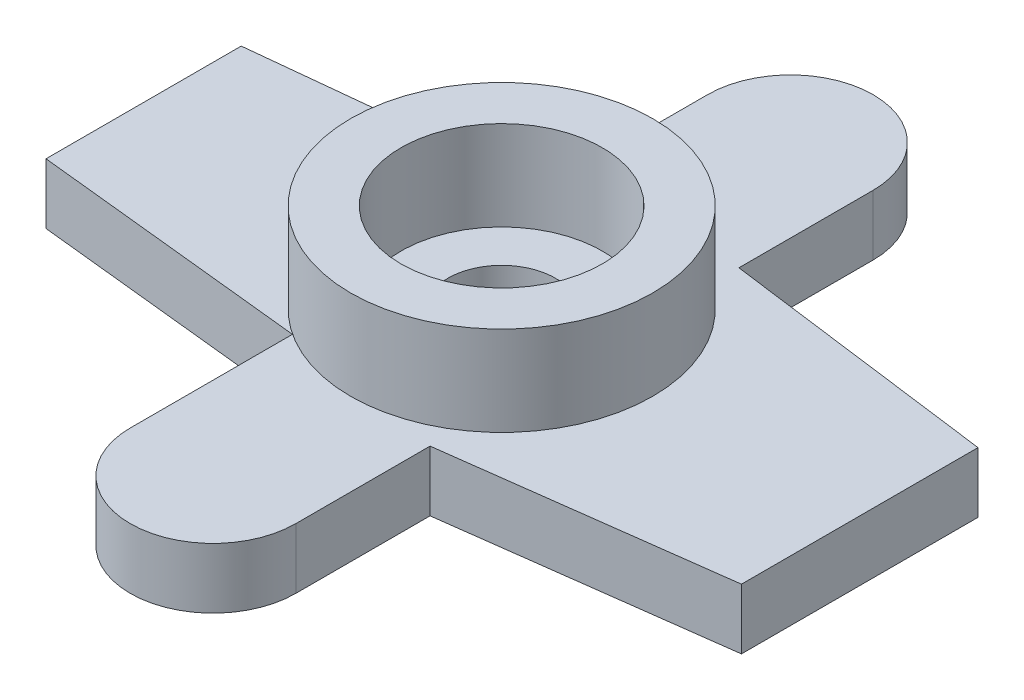
ISO-10303-21;
HEADER;
FILE_DESCRIPTION(('STEP AP214'),'2;1');
FILE_NAME('part.step','',(''),(''),'','','');
FILE_SCHEMA(('AUTOMOTIVE_DESIGN { 1 0 10303 214 1 1 1 1 }'));
ENDSEC;
DATA;
#1=APPLICATION_CONTEXT('core data for automotive mechanical design processes');
#2=APPLICATION_PROTOCOL_DEFINITION('international standard','automotive_design',2000,#1);
#3=PRODUCT_CONTEXT('',#1,'mechanical');
#4=PRODUCT('Part','Part','',(#3));
#5=PRODUCT_RELATED_PRODUCT_CATEGORY('part','',(#4));
#6=PRODUCT_DEFINITION_FORMATION('','',#4);
#7=PRODUCT_DEFINITION_CONTEXT('part definition',#1,'design');
#8=PRODUCT_DEFINITION('design','',#6,#7);
#9=PRODUCT_DEFINITION_SHAPE('','',#8);
#10=(LENGTH_UNIT() NAMED_UNIT(*) SI_UNIT(.MILLI.,.METRE.));
#11=(NAMED_UNIT(*) PLANE_ANGLE_UNIT() SI_UNIT($,.RADIAN.));
#12=(NAMED_UNIT(*) SI_UNIT($,.STERADIAN.) SOLID_ANGLE_UNIT());
#13=UNCERTAINTY_MEASURE_WITH_UNIT(LENGTH_MEASURE(1.E-05),#10,'distance_accuracy_value','');
#14=(GEOMETRIC_REPRESENTATION_CONTEXT(3) GLOBAL_UNCERTAINTY_ASSIGNED_CONTEXT((#13)) GLOBAL_UNIT_ASSIGNED_CONTEXT((#10,
#11,#12)) REPRESENTATION_CONTEXT('',''));
#15=CARTESIAN_POINT('',(0.,0.,0.));
#16=DIRECTION('',(0.,0.,1.));
#17=DIRECTION('',(1.,0.,0.));
#18=AXIS2_PLACEMENT_3D('',#15,#16,#17);
#19=CARTESIAN_POINT('',(-0.312640586171714,1.35,2.98563064108722));
#20=DIRECTION('',(-0.10414565677559,0.,0.994562055467018));
#21=DIRECTION('',(0.994562055467019,0.,0.10414565677559));
#22=AXIS2_PLACEMENT_3D('',#19,#20,#21);
#23=PLANE('',#22);
#24=DIRECTION('',(-0.994562055467019,0.,-0.10414565677559));
#25=VECTOR('',#24,1.);
#26=CARTESIAN_POINT('',(-0.312640586171714,0.,2.98563064108722));
#27=LINE('',#26,#25);
#28=CARTESIAN_POINT('',(-1.85,0.,2.82464590919123));
#29=VERTEX_POINT('',#28);
#30=CARTESIAN_POINT('',(-8.,0.,2.18064809563186));
#31=VERTEX_POINT('',#30);
#32=EDGE_CURVE('E303',#29,#31,#27,.T.);
#33=ORIENTED_EDGE('',*,*,#32,.F.);
#34=DIRECTION('',(0.,-1.,0.));
#35=VECTOR('',#34,1.);
#36=CARTESIAN_POINT('',(-1.85,1.35,2.82464590919123));
#37=LINE('',#36,#35);
#38=CARTESIAN_POINT('',(-1.85,1.35,2.82464590919123));
#39=VERTEX_POINT('',#38);
#40=EDGE_CURVE('E12',#39,#29,#37,.T.);
#41=ORIENTED_EDGE('',*,*,#40,.F.);
#42=DIRECTION('',(-0.994562055467019,0.,-0.10414565677559));
#43=VECTOR('',#42,1.);
#44=CARTESIAN_POINT('',(-0.312640586171714,1.35,2.98563064108722));
#45=LINE('',#44,#43);
#46=CARTESIAN_POINT('',(-8.,1.35,2.18064809563186));
#47=VERTEX_POINT('',#46);
#48=EDGE_CURVE('E319',#39,#47,#45,.T.);
#49=ORIENTED_EDGE('',*,*,#48,.T.);
#50=DIRECTION('',(0.,-1.,0.));
#51=VECTOR('',#50,1.);
#52=CARTESIAN_POINT('',(-8.,1.35,2.18064809563186));
#53=LINE('',#52,#51);
#54=EDGE_CURVE('E187',#47,#31,#53,.T.);
#55=ORIENTED_EDGE('',*,*,#54,.T.);
#56=EDGE_LOOP('',(#33,#41,#49,#55));
#57=FACE_BOUND('',#56,.T.);
#58=ADVANCED_FACE('F168',(#57),#23,.T.);
#59=CARTESIAN_POINT('',(-0.312640586171714,1.35,-2.98563064108722));
#60=DIRECTION('',(0.10414565677559,0.,0.994562055467018));
#61=DIRECTION('',(0.994562055467019,0.,-0.10414565677559));
#62=AXIS2_PLACEMENT_3D('',#59,#60,#61);
#63=PLANE('',#62);
#64=DIRECTION('',(-0.994562055467019,0.,0.10414565677559));
#65=VECTOR('',#64,1.);
#66=CARTESIAN_POINT('',(-0.312640586171714,0.,-2.98563064108722));
#67=LINE('',#66,#65);
#68=CARTESIAN_POINT('',(-1.85,0.,-2.82464590919123));
#69=VERTEX_POINT('',#68);
#70=CARTESIAN_POINT('',(-8.,0.,-2.18064809563186));
#71=VERTEX_POINT('',#70);
#72=EDGE_CURVE('E306',#69,#71,#67,.T.);
#73=ORIENTED_EDGE('',*,*,#72,.T.);
#74=DIRECTION('',(0.,-1.,0.));
#75=VECTOR('',#74,1.);
#76=CARTESIAN_POINT('',(-8.,1.35,-2.18064809563186));
#77=LINE('',#76,#75);
#78=CARTESIAN_POINT('',(-8.,1.35,-2.18064809563186));
#79=VERTEX_POINT('',#78);
#80=EDGE_CURVE('E321',#79,#71,#77,.T.);
#81=ORIENTED_EDGE('',*,*,#80,.F.);
#82=DIRECTION('',(-0.994562055467019,0.,0.10414565677559));
#83=VECTOR('',#82,1.);
#84=CARTESIAN_POINT('',(-0.312640586171714,1.35,-2.98563064108722));
#85=LINE('',#84,#83);
#86=CARTESIAN_POINT('',(-1.85,1.35,-2.82464590919123));
#87=VERTEX_POINT('',#86);
#88=EDGE_CURVE('E381',#87,#79,#85,.T.);
#89=ORIENTED_EDGE('',*,*,#88,.F.);
#90=DIRECTION('',(0.,-1.,0.));
#91=VECTOR('',#90,1.);
#92=CARTESIAN_POINT('',(-1.85,1.35,-2.82464590919123));
#93=LINE('',#92,#91);
#94=EDGE_CURVE('E178',#87,#69,#93,.T.);
#95=ORIENTED_EDGE('',*,*,#94,.T.);
#96=EDGE_LOOP('',(#73,#81,#89,#95));
#97=FACE_BOUND('',#96,.T.);
#98=ADVANCED_FACE('F383',(#97),#63,.F.);
#99=CARTESIAN_POINT('',(-8.,1.35,0.));
#100=DIRECTION('',(-1.,0.,0.));
#101=DIRECTION('',(0.,0.,1.));
#102=AXIS2_PLACEMENT_3D('',#99,#100,#101);
#103=PLANE('',#102);
#104=DIRECTION('',(0.,0.,-1.));
#105=VECTOR('',#104,1.);
#106=CARTESIAN_POINT('',(-8.,0.,0.));
#107=LINE('',#106,#105);
#108=EDGE_CURVE('E312',#31,#71,#107,.T.);
#109=ORIENTED_EDGE('',*,*,#108,.F.);
#110=ORIENTED_EDGE('',*,*,#54,.F.);
#111=DIRECTION('',(0.,0.,-1.));
#112=VECTOR('',#111,1.);
#113=CARTESIAN_POINT('',(-8.,1.35,0.));
#114=LINE('',#113,#112);
#115=EDGE_CURVE('E315',#47,#79,#114,.T.);
#116=ORIENTED_EDGE('',*,*,#115,.T.);
#117=ORIENTED_EDGE('',*,*,#80,.T.);
#118=EDGE_LOOP('',(#109,#110,#116,#117));
#119=FACE_BOUND('',#118,.T.);
#120=ADVANCED_FACE('F436',(#119),#103,.T.);
#121=CARTESIAN_POINT('',(0.,1.35,0.));
#122=DIRECTION('',(0.,1.,0.));
#123=DIRECTION('',(0.,0.,1.));
#124=AXIS2_PLACEMENT_3D('',#121,#122,#123);
#125=PLANE('',#124);
#126=CARTESIAN_POINT('',(0.,1.35,0.));
#127=DIRECTION('',(0.,1.,0.));
#128=DIRECTION('',(0.,0.,1.));
#129=AXIS2_PLACEMENT_3D('',#126,#127,#128);
#130=CIRCLE('',#129,3.375);
#131=CARTESIAN_POINT('',(0.,1.35,3.375));
#132=VERTEX_POINT('',#131);
#133=EDGE_CURVE('E386',#132,#132,#130,.T.);
#134=ORIENTED_EDGE('',*,*,#133,.F.);
#135=EDGE_LOOP('',(#134));
#136=FACE_BOUND('',#135,.T.);
#137=DIRECTION('',(0.,0.,-1.));
#138=VECTOR('',#137,1.);
#139=CARTESIAN_POINT('',(-1.85,1.35,0.));
#140=LINE('',#139,#138);
#141=CARTESIAN_POINT('',(-1.85,1.35,-6.45));
#142=VERTEX_POINT('',#141);
#143=EDGE_CURVE('E325',#87,#142,#140,.T.);
#144=ORIENTED_EDGE('',*,*,#143,.F.);
#145=ORIENTED_EDGE('',*,*,#88,.T.);
#146=ORIENTED_EDGE('',*,*,#115,.F.);
#147=ORIENTED_EDGE('',*,*,#48,.F.);
#148=DIRECTION('',(0.,0.,-1.));
#149=VECTOR('',#148,1.);
#150=CARTESIAN_POINT('',(-1.85,1.35,0.));
#151=LINE('',#150,#149);
#152=CARTESIAN_POINT('',(-1.85,1.35,6.45));
#153=VERTEX_POINT('',#152);
#154=EDGE_CURVE('E327',#153,#39,#151,.T.);
#155=ORIENTED_EDGE('',*,*,#154,.F.);
#156=CARTESIAN_POINT('',(0.,1.35,6.45));
#157=DIRECTION('',(0.,1.,0.));
#158=DIRECTION('',(0.,0.,1.));
#159=AXIS2_PLACEMENT_3D('',#156,#157,#158);
#160=CIRCLE('',#159,1.85);
#161=CARTESIAN_POINT('',(1.85,1.35,6.45));
#162=VERTEX_POINT('',#161);
#163=EDGE_CURVE('E330',#153,#162,#160,.T.);
#164=ORIENTED_EDGE('',*,*,#163,.T.);
#165=DIRECTION('',(0.,0.,-1.));
#166=VECTOR('',#165,1.);
#167=CARTESIAN_POINT('',(1.85,1.35,0.));
#168=LINE('',#167,#166);
#169=CARTESIAN_POINT('',(1.85,1.35,3.45));
#170=VERTEX_POINT('',#169);
#171=EDGE_CURVE('E332',#162,#170,#168,.T.);
#172=ORIENTED_EDGE('',*,*,#171,.T.);
#173=DIRECTION('',(0.991488349625111,0.,-0.130195439849762));
#174=VECTOR('',#173,1.);
#175=CARTESIAN_POINT('',(0.476710130391174,1.35,3.63033099297894));
#176=LINE('',#175,#174);
#177=CARTESIAN_POINT('',(8.,1.35,2.64242424242424));
#178=VERTEX_POINT('',#177);
#179=EDGE_CURVE('E335',#170,#178,#176,.T.);
#180=ORIENTED_EDGE('',*,*,#179,.T.);
#181=DIRECTION('',(0.,0.,-1.));
#182=VECTOR('',#181,1.);
#183=CARTESIAN_POINT('',(8.,1.35,0.));
#184=LINE('',#183,#182);
#185=CARTESIAN_POINT('',(8.,1.35,-2.64242424242424));
#186=VERTEX_POINT('',#185);
#187=EDGE_CURVE('E337',#178,#186,#184,.T.);
#188=ORIENTED_EDGE('',*,*,#187,.T.);
#189=DIRECTION('',(0.991488349625111,0.,0.130195439849762));
#190=VECTOR('',#189,1.);
#191=CARTESIAN_POINT('',(0.476710130391174,1.35,-3.63033099297894));
#192=LINE('',#191,#190);
#193=CARTESIAN_POINT('',(1.85,1.35,-3.45));
#194=VERTEX_POINT('',#193);
#195=EDGE_CURVE('E265',#194,#186,#192,.T.);
#196=ORIENTED_EDGE('',*,*,#195,.F.);
#197=DIRECTION('',(0.,0.,-1.));
#198=VECTOR('',#197,1.);
#199=CARTESIAN_POINT('',(1.85,1.35,0.));
#200=LINE('',#199,#198);
#201=CARTESIAN_POINT('',(1.85,1.35,-6.45));
#202=VERTEX_POINT('',#201);
#203=EDGE_CURVE('E263',#194,#202,#200,.T.);
#204=ORIENTED_EDGE('',*,*,#203,.T.);
#205=CARTESIAN_POINT('',(0.,1.35,-6.45));
#206=DIRECTION('',(0.,1.,0.));
#207=DIRECTION('',(0.,0.,1.));
#208=AXIS2_PLACEMENT_3D('',#205,#206,#207);
#209=CIRCLE('',#208,1.85);
#210=EDGE_CURVE('E282',#202,#142,#209,.T.);
#211=ORIENTED_EDGE('',*,*,#210,.T.);
#212=EDGE_LOOP('',(#144,#145,#146,#147,#155,#164,#172,#180,#188,#196,#204,#211));
#213=FACE_BOUND('',#212,.T.);
#214=ADVANCED_FACE('F360',(#136,#213),#125,.T.);
#215=CARTESIAN_POINT('',(0.,0.,0.));
#216=DIRECTION('',(0.,1.,0.));
#217=DIRECTION('',(0.,0.,1.));
#218=AXIS2_PLACEMENT_3D('',#215,#216,#217);
#219=PLANE('',#218);
#220=CARTESIAN_POINT('',(0.,0.,0.));
#221=DIRECTION('',(0.,1.,0.));
#222=DIRECTION('',(0.,0.,1.));
#223=AXIS2_PLACEMENT_3D('',#220,#221,#222);
#224=CIRCLE('',#223,1.2);
#225=CARTESIAN_POINT('',(0.,0.,1.2));
#226=VERTEX_POINT('',#225);
#227=EDGE_CURVE('E395',#226,#226,#224,.T.);
#228=ORIENTED_EDGE('',*,*,#227,.T.);
#229=EDGE_LOOP('',(#228));
#230=FACE_BOUND('',#229,.T.);
#231=ORIENTED_EDGE('',*,*,#72,.F.);
#232=DIRECTION('',(0.,0.,-1.));
#233=VECTOR('',#232,1.);
#234=CARTESIAN_POINT('',(-1.85,0.,0.));
#235=LINE('',#234,#233);
#236=CARTESIAN_POINT('',(-1.85,0.,-6.45));
#237=VERTEX_POINT('',#236);
#238=EDGE_CURVE('E341',#69,#237,#235,.T.);
#239=ORIENTED_EDGE('',*,*,#238,.T.);
#240=CARTESIAN_POINT('',(0.,0.,-6.45));
#241=DIRECTION('',(0.,1.,0.));
#242=DIRECTION('',(0.,0.,1.));
#243=AXIS2_PLACEMENT_3D('',#240,#241,#242);
#244=CIRCLE('',#243,1.85);
#245=CARTESIAN_POINT('',(1.85,0.,-6.45));
#246=VERTEX_POINT('',#245);
#247=EDGE_CURVE('E275',#246,#237,#244,.T.);
#248=ORIENTED_EDGE('',*,*,#247,.F.);
#249=DIRECTION('',(0.,0.,-1.));
#250=VECTOR('',#249,1.);
#251=CARTESIAN_POINT('',(1.85,0.,0.));
#252=LINE('',#251,#250);
#253=CARTESIAN_POINT('',(1.85,0.,-3.45));
#254=VERTEX_POINT('',#253);
#255=EDGE_CURVE('E261',#254,#246,#252,.T.);
#256=ORIENTED_EDGE('',*,*,#255,.F.);
#257=DIRECTION('',(0.991488349625111,0.,0.130195439849762));
#258=VECTOR('',#257,1.);
#259=CARTESIAN_POINT('',(0.476710130391174,0.,-3.63033099297894));
#260=LINE('',#259,#258);
#261=CARTESIAN_POINT('',(8.,0.,-2.64242424242424));
#262=VERTEX_POINT('',#261);
#263=EDGE_CURVE('E272',#254,#262,#260,.T.);
#264=ORIENTED_EDGE('',*,*,#263,.T.);
#265=DIRECTION('',(0.,0.,-1.));
#266=VECTOR('',#265,1.);
#267=CARTESIAN_POINT('',(8.,0.,0.));
#268=LINE('',#267,#266);
#269=CARTESIAN_POINT('',(8.,0.,2.64242424242424));
#270=VERTEX_POINT('',#269);
#271=EDGE_CURVE('E280',#270,#262,#268,.T.);
#272=ORIENTED_EDGE('',*,*,#271,.F.);
#273=DIRECTION('',(0.991488349625111,0.,-0.130195439849762));
#274=VECTOR('',#273,1.);
#275=CARTESIAN_POINT('',(0.476710130391174,0.,3.63033099297894));
#276=LINE('',#275,#274);
#277=CARTESIAN_POINT('',(1.85,0.,3.45));
#278=VERTEX_POINT('',#277);
#279=EDGE_CURVE('E284',#278,#270,#276,.T.);
#280=ORIENTED_EDGE('',*,*,#279,.F.);
#281=DIRECTION('',(0.,0.,-1.));
#282=VECTOR('',#281,1.);
#283=CARTESIAN_POINT('',(1.85,0.,0.));
#284=LINE('',#283,#282);
#285=CARTESIAN_POINT('',(1.85,0.,6.45));
#286=VERTEX_POINT('',#285);
#287=EDGE_CURVE('E347',#286,#278,#284,.T.);
#288=ORIENTED_EDGE('',*,*,#287,.F.);
#289=CARTESIAN_POINT('',(0.,0.,6.45));
#290=DIRECTION('',(0.,1.,0.));
#291=DIRECTION('',(0.,0.,1.));
#292=AXIS2_PLACEMENT_3D('',#289,#290,#291);
#293=CIRCLE('',#292,1.85);
#294=CARTESIAN_POINT('',(-1.85,0.,6.45));
#295=VERTEX_POINT('',#294);
#296=EDGE_CURVE('E345',#295,#286,#293,.T.);
#297=ORIENTED_EDGE('',*,*,#296,.F.);
#298=DIRECTION('',(0.,0.,-1.));
#299=VECTOR('',#298,1.);
#300=CARTESIAN_POINT('',(-1.85,0.,0.));
#301=LINE('',#300,#299);
#302=EDGE_CURVE('E343',#295,#29,#301,.T.);
#303=ORIENTED_EDGE('',*,*,#302,.T.);
#304=ORIENTED_EDGE('',*,*,#32,.T.);
#305=ORIENTED_EDGE('',*,*,#108,.T.);
#306=EDGE_LOOP('',(#231,#239,#248,#256,#264,#272,#280,#288,#297,#303,#304,#305));
#307=FACE_BOUND('',#306,.T.);
#308=ADVANCED_FACE('F270',(#230,#307),#219,.F.);
#309=CARTESIAN_POINT('',(0.476710130391174,1.35,3.63033099297894));
#310=DIRECTION('',(-0.130195439849762,0.,-0.991488349625111));
#311=DIRECTION('',(-0.991488349625111,0.,0.130195439849762));
#312=AXIS2_PLACEMENT_3D('',#309,#310,#311);
#313=PLANE('',#312);
#314=ORIENTED_EDGE('',*,*,#279,.T.);
#315=DIRECTION('',(0.,-1.,0.));
#316=VECTOR('',#315,1.);
#317=CARTESIAN_POINT('',(8.,1.35,2.64242424242424));
#318=LINE('',#317,#316);
#319=EDGE_CURVE('E289',#178,#270,#318,.T.);
#320=ORIENTED_EDGE('',*,*,#319,.F.);
#321=ORIENTED_EDGE('',*,*,#179,.F.);
#322=DIRECTION('',(0.,-1.,0.));
#323=VECTOR('',#322,1.);
#324=CARTESIAN_POINT('',(1.85,1.35,3.45));
#325=LINE('',#324,#323);
#326=EDGE_CURVE('E292',#170,#278,#325,.T.);
#327=ORIENTED_EDGE('',*,*,#326,.T.);
#328=EDGE_LOOP('',(#314,#320,#321,#327));
#329=FACE_BOUND('',#328,.T.);
#330=ADVANCED_FACE('F352',(#329),#313,.F.);
#331=CARTESIAN_POINT('',(8.,1.35,0.));
#332=DIRECTION('',(-1.,0.,0.));
#333=DIRECTION('',(0.,0.,1.));
#334=AXIS2_PLACEMENT_3D('',#331,#332,#333);
#335=PLANE('',#334);
#336=ORIENTED_EDGE('',*,*,#271,.T.);
#337=DIRECTION('',(0.,-1.,0.));
#338=VECTOR('',#337,1.);
#339=CARTESIAN_POINT('',(8.,1.35,-2.64242424242424));
#340=LINE('',#339,#338);
#341=EDGE_CURVE('E252',#186,#262,#340,.T.);
#342=ORIENTED_EDGE('',*,*,#341,.F.);
#343=ORIENTED_EDGE('',*,*,#187,.F.);
#344=ORIENTED_EDGE('',*,*,#319,.T.);
#345=EDGE_LOOP('',(#336,#342,#343,#344));
#346=FACE_BOUND('',#345,.T.);
#347=ADVANCED_FACE('F357',(#346),#335,.F.);
#348=CARTESIAN_POINT('',(0.476710130391174,1.35,-3.63033099297894));
#349=DIRECTION('',(0.130195439849762,0.,-0.991488349625111));
#350=DIRECTION('',(-0.991488349625111,0.,-0.130195439849762));
#351=AXIS2_PLACEMENT_3D('',#348,#349,#350);
#352=PLANE('',#351);
#353=ORIENTED_EDGE('',*,*,#263,.F.);
#354=DIRECTION('',(0.,-1.,0.));
#355=VECTOR('',#354,1.);
#356=CARTESIAN_POINT('',(1.85,1.35,-3.45));
#357=LINE('',#356,#355);
#358=EDGE_CURVE('E258',#194,#254,#357,.T.);
#359=ORIENTED_EDGE('',*,*,#358,.F.);
#360=ORIENTED_EDGE('',*,*,#195,.T.);
#361=ORIENTED_EDGE('',*,*,#341,.T.);
#362=EDGE_LOOP('',(#353,#359,#360,#361));
#363=FACE_BOUND('',#362,.T.);
#364=ADVANCED_FACE('F279',(#363),#352,.T.);
#365=CARTESIAN_POINT('',(1.85,1.35,0.));
#366=DIRECTION('',(-1.,0.,0.));
#367=DIRECTION('',(0.,0.,1.));
#368=AXIS2_PLACEMENT_3D('',#365,#366,#367);
#369=PLANE('',#368);
#370=ORIENTED_EDGE('',*,*,#255,.T.);
#371=DIRECTION('',(0.,-1.,0.));
#372=VECTOR('',#371,1.);
#373=CARTESIAN_POINT('',(1.85,1.35,-6.45));
#374=LINE('',#373,#372);
#375=EDGE_CURVE('E172',#202,#246,#374,.T.);
#376=ORIENTED_EDGE('',*,*,#375,.F.);
#377=ORIENTED_EDGE('',*,*,#203,.F.);
#378=ORIENTED_EDGE('',*,*,#358,.T.);
#379=EDGE_LOOP('',(#370,#376,#377,#378));
#380=FACE_BOUND('',#379,.T.);
#381=ADVANCED_FACE('F170',(#380),#369,.F.);
#382=CARTESIAN_POINT('',(1.85,1.35,0.));
#383=DIRECTION('',(-1.,0.,0.));
#384=DIRECTION('',(0.,0.,1.));
#385=AXIS2_PLACEMENT_3D('',#382,#383,#384);
#386=PLANE('',#385);
#387=ORIENTED_EDGE('',*,*,#287,.T.);
#388=ORIENTED_EDGE('',*,*,#326,.F.);
#389=ORIENTED_EDGE('',*,*,#171,.F.);
#390=DIRECTION('',(0.,-1.,0.));
#391=VECTOR('',#390,1.);
#392=CARTESIAN_POINT('',(1.85,1.35,6.45));
#393=LINE('',#392,#391);
#394=EDGE_CURVE('E294',#162,#286,#393,.T.);
#395=ORIENTED_EDGE('',*,*,#394,.T.);
#396=EDGE_LOOP('',(#387,#388,#389,#395));
#397=FACE_BOUND('',#396,.T.);
#398=ADVANCED_FACE('F366',(#397),#386,.F.);
#399=CARTESIAN_POINT('',(0.,1.35,6.45));
#400=DIRECTION('',(0.,-1.,0.));
#401=DIRECTION('',(0.,0.,-1.));
#402=AXIS2_PLACEMENT_3D('',#399,#400,#401);
#403=CYLINDRICAL_SURFACE('',#402,1.85);
#404=ORIENTED_EDGE('',*,*,#296,.T.);
#405=ORIENTED_EDGE('',*,*,#394,.F.);
#406=ORIENTED_EDGE('',*,*,#163,.F.);
#407=DIRECTION('',(0.,-1.,0.));
#408=VECTOR('',#407,1.);
#409=CARTESIAN_POINT('',(-1.85,1.35,6.45));
#410=LINE('',#409,#408);
#411=EDGE_CURVE('E297',#153,#295,#410,.T.);
#412=ORIENTED_EDGE('',*,*,#411,.T.);
#413=EDGE_LOOP('',(#404,#405,#406,#412));
#414=FACE_BOUND('',#413,.T.);
#415=ADVANCED_FACE('F452',(#414),#403,.T.);
#416=CARTESIAN_POINT('',(0.,1.35,-6.45));
#417=DIRECTION('',(0.,-1.,0.));
#418=DIRECTION('',(0.,0.,-1.));
#419=AXIS2_PLACEMENT_3D('',#416,#417,#418);
#420=CYLINDRICAL_SURFACE('',#419,1.85);
#421=ORIENTED_EDGE('',*,*,#247,.T.);
#422=DIRECTION('',(0.,-1.,0.));
#423=VECTOR('',#422,1.);
#424=CARTESIAN_POINT('',(-1.85,1.35,-6.45));
#425=LINE('',#424,#423);
#426=EDGE_CURVE('E298',#142,#237,#425,.T.);
#427=ORIENTED_EDGE('',*,*,#426,.F.);
#428=ORIENTED_EDGE('',*,*,#210,.F.);
#429=ORIENTED_EDGE('',*,*,#375,.T.);
#430=EDGE_LOOP('',(#421,#427,#428,#429));
#431=FACE_BOUND('',#430,.T.);
#432=ADVANCED_FACE('F445',(#431),#420,.T.);
#433=CARTESIAN_POINT('',(-1.85,1.35,0.));
#434=DIRECTION('',(-1.,0.,0.));
#435=DIRECTION('',(0.,0.,1.));
#436=AXIS2_PLACEMENT_3D('',#433,#434,#435);
#437=PLANE('',#436);
#438=ORIENTED_EDGE('',*,*,#238,.F.);
#439=ORIENTED_EDGE('',*,*,#94,.F.);
#440=ORIENTED_EDGE('',*,*,#143,.T.);
#441=ORIENTED_EDGE('',*,*,#426,.T.);
#442=EDGE_LOOP('',(#438,#439,#440,#441));
#443=FACE_BOUND('',#442,.T.);
#444=ADVANCED_FACE('F378',(#443),#437,.T.);
#445=CARTESIAN_POINT('',(-1.85,1.35,0.));
#446=DIRECTION('',(-1.,0.,0.));
#447=DIRECTION('',(0.,0.,1.));
#448=AXIS2_PLACEMENT_3D('',#445,#446,#447);
#449=PLANE('',#448);
#450=ORIENTED_EDGE('',*,*,#302,.F.);
#451=ORIENTED_EDGE('',*,*,#411,.F.);
#452=ORIENTED_EDGE('',*,*,#154,.T.);
#453=ORIENTED_EDGE('',*,*,#40,.T.);
#454=EDGE_LOOP('',(#450,#451,#452,#453));
#455=FACE_BOUND('',#454,.T.);
#456=ADVANCED_FACE('F371',(#455),#449,.T.);
#457=CARTESIAN_POINT('',(0.,3.35,0.));
#458=DIRECTION('',(0.,-1.,0.));
#459=DIRECTION('',(0.,0.,-1.));
#460=AXIS2_PLACEMENT_3D('',#457,#458,#459);
#461=CYLINDRICAL_SURFACE('',#460,3.375);
#462=CARTESIAN_POINT('',(0.,3.35,0.));
#463=DIRECTION('',(0.,1.,0.));
#464=DIRECTION('',(0.,0.,1.));
#465=AXIS2_PLACEMENT_3D('',#462,#463,#464);
#466=CIRCLE('',#465,3.375);
#467=CARTESIAN_POINT('',(0.,3.35,3.375));
#468=VERTEX_POINT('',#467);
#469=EDGE_CURVE('E277',#468,#468,#466,.T.);
#470=ORIENTED_EDGE('',*,*,#469,.F.);
#471=EDGE_LOOP('',(#470));
#472=FACE_BOUND('',#471,.T.);
#473=ORIENTED_EDGE('',*,*,#133,.T.);
#474=EDGE_LOOP('',(#473));
#475=FACE_BOUND('',#474,.T.);
#476=ADVANCED_FACE('F426',(#472,#475),#461,.T.);
#477=CARTESIAN_POINT('',(0.,3.35,0.));
#478=DIRECTION('',(0.,1.,0.));
#479=DIRECTION('',(0.,0.,1.));
#480=AXIS2_PLACEMENT_3D('',#477,#478,#479);
#481=PLANE('',#480);
#482=CARTESIAN_POINT('',(0.,3.35,0.));
#483=DIRECTION('',(0.,1.,0.));
#484=DIRECTION('',(0.,0.,1.));
#485=AXIS2_PLACEMENT_3D('',#482,#483,#484);
#486=CIRCLE('',#485,2.25);
#487=CARTESIAN_POINT('',(0.,3.35,2.25));
#488=VERTEX_POINT('',#487);
#489=EDGE_CURVE('E392',#488,#488,#486,.T.);
#490=ORIENTED_EDGE('',*,*,#489,.F.);
#491=EDGE_LOOP('',(#490));
#492=FACE_BOUND('',#491,.T.);
#493=ORIENTED_EDGE('',*,*,#469,.T.);
#494=EDGE_LOOP('',(#493));
#495=FACE_BOUND('',#494,.T.);
#496=ADVANCED_FACE('F420',(#492,#495),#481,.T.);
#497=CARTESIAN_POINT('',(0.,1.35,0.));
#498=DIRECTION('',(0.,1.,0.));
#499=DIRECTION('',(0.,0.,1.));
#500=AXIS2_PLACEMENT_3D('',#497,#498,#499);
#501=CYLINDRICAL_SURFACE('',#500,2.25);
#502=CARTESIAN_POINT('',(0.,1.35,0.));
#503=DIRECTION('',(0.,1.,0.));
#504=DIRECTION('',(0.,0.,1.));
#505=AXIS2_PLACEMENT_3D('',#502,#503,#504);
#506=CIRCLE('',#505,2.25);
#507=CARTESIAN_POINT('',(0.,1.35,2.25));
#508=VERTEX_POINT('',#507);
#509=EDGE_CURVE('E389',#508,#508,#506,.T.);
#510=ORIENTED_EDGE('',*,*,#509,.F.);
#511=EDGE_LOOP('',(#510));
#512=FACE_BOUND('',#511,.T.);
#513=ORIENTED_EDGE('',*,*,#489,.T.);
#514=EDGE_LOOP('',(#513));
#515=FACE_BOUND('',#514,.T.);
#516=ADVANCED_FACE('F414',(#512,#515),#501,.F.);
#517=CARTESIAN_POINT('',(0.,1.35,0.));
#518=DIRECTION('',(0.,1.,0.));
#519=DIRECTION('',(0.,0.,1.));
#520=AXIS2_PLACEMENT_3D('',#517,#518,#519);
#521=PLANE('',#520);
#522=CARTESIAN_POINT('',(0.,1.35,0.));
#523=DIRECTION('',(0.,1.,0.));
#524=DIRECTION('',(0.,0.,1.));
#525=AXIS2_PLACEMENT_3D('',#522,#523,#524);
#526=CIRCLE('',#525,1.2);
#527=CARTESIAN_POINT('',(0.,1.35,1.2));
#528=VERTEX_POINT('',#527);
#529=EDGE_CURVE('E398',#528,#528,#526,.T.);
#530=ORIENTED_EDGE('',*,*,#529,.F.);
#531=EDGE_LOOP('',(#530));
#532=FACE_BOUND('',#531,.T.);
#533=ORIENTED_EDGE('',*,*,#509,.T.);
#534=EDGE_LOOP('',(#533));
#535=FACE_BOUND('',#534,.T.);
#536=ADVANCED_FACE('F408',(#532,#535),#521,.T.);
#537=CARTESIAN_POINT('',(0.,0.,0.));
#538=DIRECTION('',(0.,1.,0.));
#539=DIRECTION('',(0.,0.,1.));
#540=AXIS2_PLACEMENT_3D('',#537,#538,#539);
#541=CYLINDRICAL_SURFACE('',#540,1.2);
#542=CARTESIAN_POINT('',(0.,0.,1.2));
#543=CARTESIAN_POINT('',(0.,0.0140625,1.2));
#544=CARTESIAN_POINT('',(0.,0.028125,1.2));
#545=CARTESIAN_POINT('',(0.,0.05625,1.2));
#546=CARTESIAN_POINT('',(0.,0.0703125,1.2));
#547=CARTESIAN_POINT('',(0.,0.0984375,1.2));
#548=CARTESIAN_POINT('',(0.,0.1125,1.2));
#549=CARTESIAN_POINT('',(0.,0.140625,1.2));
#550=CARTESIAN_POINT('',(0.,0.1546875,1.2));
#551=CARTESIAN_POINT('',(0.,0.1828125,1.2));
#552=CARTESIAN_POINT('',(0.,0.196875,1.2));
#553=CARTESIAN_POINT('',(0.,0.225,1.2));
#554=CARTESIAN_POINT('',(0.,0.2390625,1.2));
#555=CARTESIAN_POINT('',(0.,0.2671875,1.2));
#556=CARTESIAN_POINT('',(0.,0.28125,1.2));
#557=CARTESIAN_POINT('',(0.,0.309375,1.2));
#558=CARTESIAN_POINT('',(0.,0.3234375,1.2));
#559=CARTESIAN_POINT('',(0.,0.3515625,1.2));
#560=CARTESIAN_POINT('',(0.,0.365625,1.2));
#561=CARTESIAN_POINT('',(0.,0.39375,1.2));
#562=CARTESIAN_POINT('',(0.,0.4078125,1.2));
#563=CARTESIAN_POINT('',(0.,0.4359375,1.2));
#564=CARTESIAN_POINT('',(0.,0.45,1.2));
#565=CARTESIAN_POINT('',(0.,0.478125,1.2));
#566=CARTESIAN_POINT('',(0.,0.4921875,1.2));
#567=CARTESIAN_POINT('',(0.,0.5203125,1.2));
#568=CARTESIAN_POINT('',(0.,0.534375,1.2));
#569=CARTESIAN_POINT('',(0.,0.5625,1.2));
#570=CARTESIAN_POINT('',(0.,0.5765625,1.2));
#571=CARTESIAN_POINT('',(0.,0.6046875,1.2));
#572=CARTESIAN_POINT('',(0.,0.61875,1.2));
#573=CARTESIAN_POINT('',(0.,0.646875,1.2));
#574=CARTESIAN_POINT('',(0.,0.6609375,1.2));
#575=CARTESIAN_POINT('',(0.,0.6890625,1.2));
#576=CARTESIAN_POINT('',(0.,0.703125,1.2));
#577=CARTESIAN_POINT('',(0.,0.73125,1.2));
#578=CARTESIAN_POINT('',(0.,0.7453125,1.2));
#579=CARTESIAN_POINT('',(0.,0.7734375,1.2));
#580=CARTESIAN_POINT('',(0.,0.7875,1.2));
#581=CARTESIAN_POINT('',(0.,0.815625,1.2));
#582=CARTESIAN_POINT('',(0.,0.8296875,1.2));
#583=CARTESIAN_POINT('',(0.,0.8578125,1.2));
#584=CARTESIAN_POINT('',(0.,0.871875,1.2));
#585=CARTESIAN_POINT('',(0.,0.9,1.2));
#586=CARTESIAN_POINT('',(0.,0.9140625,1.2));
#587=CARTESIAN_POINT('',(0.,0.9421875,1.2));
#588=CARTESIAN_POINT('',(0.,0.95625,1.2));
#589=CARTESIAN_POINT('',(0.,0.984375,1.2));
#590=CARTESIAN_POINT('',(0.,0.9984375,1.2));
#591=CARTESIAN_POINT('',(0.,1.0265625,1.2));
#592=CARTESIAN_POINT('',(0.,1.040625,1.2));
#593=CARTESIAN_POINT('',(0.,1.06875,1.2));
#594=CARTESIAN_POINT('',(0.,1.0828125,1.2));
#595=CARTESIAN_POINT('',(0.,1.1109375,1.2));
#596=CARTESIAN_POINT('',(0.,1.125,1.2));
#597=CARTESIAN_POINT('',(0.,1.153125,1.2));
#598=CARTESIAN_POINT('',(0.,1.1671875,1.2));
#599=CARTESIAN_POINT('',(0.,1.1953125,1.2));
#600=CARTESIAN_POINT('',(0.,1.209375,1.2));
#601=CARTESIAN_POINT('',(0.,1.2375,1.2));
#602=CARTESIAN_POINT('',(0.,1.2515625,1.2));
#603=CARTESIAN_POINT('',(0.,1.2796875,1.2));
#604=CARTESIAN_POINT('',(0.,1.29375,1.2));
#605=CARTESIAN_POINT('',(0.,1.321875,1.2));
#606=CARTESIAN_POINT('',(0.,1.3359375,1.2));
#607=CARTESIAN_POINT('',(0.,1.35,1.2));
#608=B_SPLINE_CURVE_WITH_KNOTS('',3,(#542,#543,#544,#545,#546,#547,#548,#549,#550,#551,#552,
#553,#554,#555,#556,#557,#558,#559,#560,#561,#562,#563,#564,#565,#566,#567,#568,#569,#570,#571,
#572,#573,#574,#575,#576,#577,#578,#579,#580,#581,#582,#583,#584,#585,#586,#587,#588,#589,#590,
#591,#592,#593,#594,#595,#596,#597,#598,#599,#600,#601,#602,#603,#604,#605,#606,#607),
.UNSPECIFIED.,.F.,.F.,(4,2,2,2,2,2,2,2,2,2,2,2,2,2,2,2,2,2,2,2,2,2,2,2,2,2,2,2,2,2,2,2,4),(0.,
0.0421875,0.084375,0.1265625,0.16875,0.2109375,0.253125,0.2953125,0.3375,0.3796875,0.421875,
0.4640625,0.50625,0.5484375,0.590625,0.6328125,0.675,0.7171875,0.759375,0.8015625,0.84375,
0.8859375,0.928125,0.9703125,1.0125,1.0546875,1.096875,1.1390625,1.18125,1.2234375,1.265625,
1.3078125,1.35),.UNSPECIFIED.);
#609=EDGE_CURVE('BSEAM405',#226,#528,#608,.T.);
#610=ORIENTED_EDGE('',*,*,#227,.F.);
#611=ORIENTED_EDGE('',*,*,#529,.T.);
#612=ORIENTED_EDGE('',*,*,#609,.T.);
#613=ORIENTED_EDGE('',*,*,#609,.F.);
#614=EDGE_LOOP('',(#610,#612,#611,#613));
#615=FACE_BOUND('',#614,.T.);
#616=ADVANCED_FACE('F405',(#615),#541,.F.);
#617=CLOSED_SHELL('',(#58,#98,#120,#214,#308,#330,#347,#364,#381,#398,#415,#432,#444,#456,#476,
#496,#516,#536,#616));
#618=MANIFOLD_SOLID_BREP('B2',#617);
#619=ADVANCED_BREP_SHAPE_REPRESENTATION('',(#18,#618),#14);
#620=SHAPE_DEFINITION_REPRESENTATION(#9,#619);
ENDSEC;
END-ISO-10303-21;
